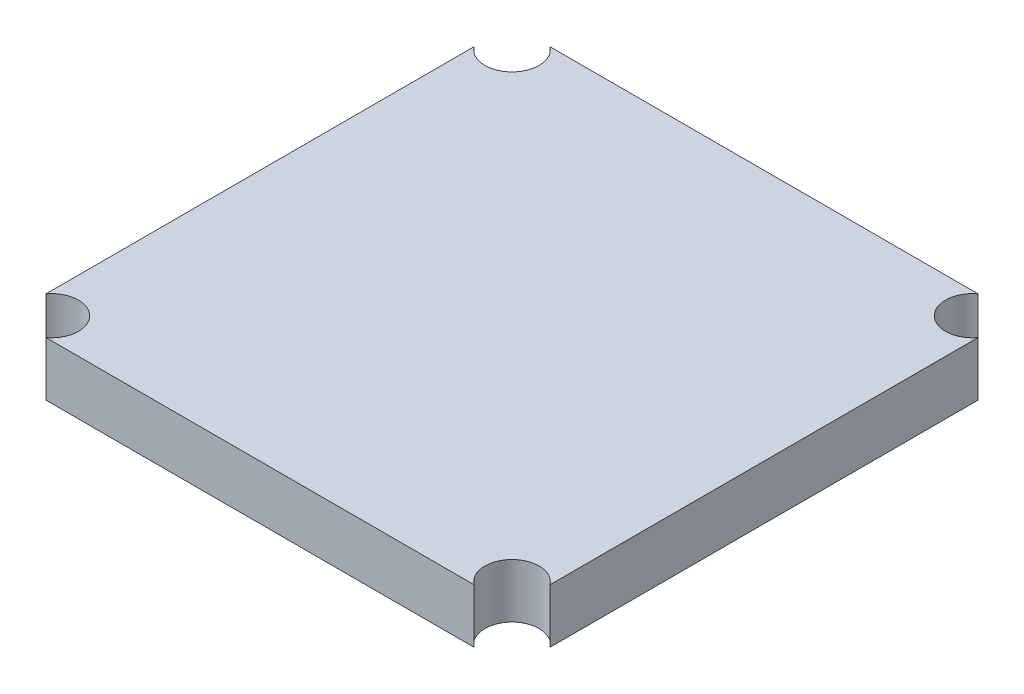
ISO-10303-21;
HEADER;
FILE_DESCRIPTION(('STEP AP214'),'2;1');
FILE_NAME('part.step','',(''),(''),'','','');
FILE_SCHEMA(('AUTOMOTIVE_DESIGN { 1 0 10303 214 1 1 1 1 }'));
ENDSEC;
DATA;
#1=APPLICATION_CONTEXT('core data for automotive mechanical design processes');
#2=APPLICATION_PROTOCOL_DEFINITION('international standard','automotive_design',2000,#1);
#3=PRODUCT_CONTEXT('',#1,'mechanical');
#4=PRODUCT('Part','Part','',(#3));
#5=PRODUCT_RELATED_PRODUCT_CATEGORY('part','',(#4));
#6=PRODUCT_DEFINITION_FORMATION('','',#4);
#7=PRODUCT_DEFINITION_CONTEXT('part definition',#1,'design');
#8=PRODUCT_DEFINITION('design','',#6,#7);
#9=PRODUCT_DEFINITION_SHAPE('','',#8);
#10=(LENGTH_UNIT() NAMED_UNIT(*) SI_UNIT(.MILLI.,.METRE.));
#11=(NAMED_UNIT(*) PLANE_ANGLE_UNIT() SI_UNIT($,.RADIAN.));
#12=(NAMED_UNIT(*) SI_UNIT($,.STERADIAN.) SOLID_ANGLE_UNIT());
#13=UNCERTAINTY_MEASURE_WITH_UNIT(LENGTH_MEASURE(1.E-05),#10,'distance_accuracy_value','');
#14=(GEOMETRIC_REPRESENTATION_CONTEXT(3) GLOBAL_UNCERTAINTY_ASSIGNED_CONTEXT((#13)) GLOBAL_UNIT_ASSIGNED_CONTEXT((#10,
#11,#12)) REPRESENTATION_CONTEXT('',''));
#15=CARTESIAN_POINT('',(0.,0.,0.));
#16=DIRECTION('',(0.,0.,1.));
#17=DIRECTION('',(1.,0.,0.));
#18=AXIS2_PLACEMENT_3D('',#15,#16,#17);
#19=CARTESIAN_POINT('',(-12.75,3.,12.75));
#20=DIRECTION('',(0.,-1.,0.));
#21=DIRECTION('',(0.,0.,-1.));
#22=AXIS2_PLACEMENT_3D('',#19,#20,#21);
#23=CYLINDRICAL_SURFACE('',#22,1.50000000000017);
#24=CARTESIAN_POINT('',(-12.75,0.,12.75));
#25=DIRECTION('',(0.,1.,0.));
#26=DIRECTION('',(0.,0.,1.));
#27=AXIS2_PLACEMENT_3D('',#24,#25,#26);
#28=CIRCLE('',#27,1.50000000000017);
#29=CARTESIAN_POINT('',(-11.85,0.,13.95));
#30=VERTEX_POINT('',#29);
#31=CARTESIAN_POINT('',(-13.95,0.,11.8499999999997));
#32=VERTEX_POINT('',#31);
#33=EDGE_CURVE('E129',#30,#32,#28,.T.);
#34=ORIENTED_EDGE('',*,*,#33,.F.);
#35=DIRECTION('',(0.,-1.,0.));
#36=VECTOR('',#35,1.);
#37=CARTESIAN_POINT('',(-11.85,3.,13.95));
#38=LINE('',#37,#36);
#39=CARTESIAN_POINT('',(-11.85,3.,13.95));
#40=VERTEX_POINT('',#39);
#41=EDGE_CURVE('E11',#40,#30,#38,.T.);
#42=ORIENTED_EDGE('',*,*,#41,.F.);
#43=CARTESIAN_POINT('',(-12.75,3.,12.75));
#44=DIRECTION('',(0.,1.,0.));
#45=DIRECTION('',(0.,0.,1.));
#46=AXIS2_PLACEMENT_3D('',#43,#44,#45);
#47=CIRCLE('',#46,1.50000000000017);
#48=CARTESIAN_POINT('',(-13.95,3.,11.8499999999997));
#49=VERTEX_POINT('',#48);
#50=EDGE_CURVE('E149',#40,#49,#47,.T.);
#51=ORIENTED_EDGE('',*,*,#50,.T.);
#52=DIRECTION('',(0.,-1.,0.));
#53=VECTOR('',#52,1.);
#54=CARTESIAN_POINT('',(-13.95,3.,11.8499999999997));
#55=LINE('',#54,#53);
#56=EDGE_CURVE('E86',#49,#32,#55,.T.);
#57=ORIENTED_EDGE('',*,*,#56,.T.);
#58=EDGE_LOOP('',(#34,#42,#51,#57));
#59=FACE_BOUND('',#58,.T.);
#60=ADVANCED_FACE('F36',(#59),#23,.F.);
#61=CARTESIAN_POINT('',(0.,3.,13.95));
#62=DIRECTION('',(0.,0.,-1.));
#63=DIRECTION('',(-1.,0.,0.));
#64=AXIS2_PLACEMENT_3D('',#61,#62,#63);
#65=PLANE('',#64);
#66=DIRECTION('',(1.,0.,0.));
#67=VECTOR('',#66,1.);
#68=CARTESIAN_POINT('',(0.,0.,13.95));
#69=LINE('',#68,#67);
#70=CARTESIAN_POINT('',(11.85,0.,13.95));
#71=VERTEX_POINT('',#70);
#72=EDGE_CURVE('E132',#30,#71,#69,.T.);
#73=ORIENTED_EDGE('',*,*,#72,.T.);
#74=DIRECTION('',(0.,-1.,0.));
#75=VECTOR('',#74,1.);
#76=CARTESIAN_POINT('',(11.85,3.,13.95));
#77=LINE('',#76,#75);
#78=CARTESIAN_POINT('',(11.85,3.,13.95));
#79=VERTEX_POINT('',#78);
#80=EDGE_CURVE('E44',#79,#71,#77,.T.);
#81=ORIENTED_EDGE('',*,*,#80,.F.);
#82=DIRECTION('',(1.,0.,0.));
#83=VECTOR('',#82,1.);
#84=CARTESIAN_POINT('',(0.,3.,13.95));
#85=LINE('',#84,#83);
#86=EDGE_CURVE('E176',#40,#79,#85,.T.);
#87=ORIENTED_EDGE('',*,*,#86,.F.);
#88=ORIENTED_EDGE('',*,*,#41,.T.);
#89=EDGE_LOOP('',(#73,#81,#87,#88));
#90=FACE_BOUND('',#89,.T.);
#91=ADVANCED_FACE('F165',(#90),#65,.F.);
#92=CARTESIAN_POINT('',(12.75,3.,12.75));
#93=DIRECTION('',(0.,-1.,0.));
#94=DIRECTION('',(0.,0.,-1.));
#95=AXIS2_PLACEMENT_3D('',#92,#93,#94);
#96=CYLINDRICAL_SURFACE('',#95,1.50000000000011);
#97=CARTESIAN_POINT('',(12.75,0.,12.75));
#98=DIRECTION('',(0.,1.,0.));
#99=DIRECTION('',(0.,0.,1.));
#100=AXIS2_PLACEMENT_3D('',#97,#98,#99);
#101=CIRCLE('',#100,1.50000000000011);
#102=CARTESIAN_POINT('',(13.95,0.,11.85));
#103=VERTEX_POINT('',#102);
#104=EDGE_CURVE('E135',#103,#71,#101,.T.);
#105=ORIENTED_EDGE('',*,*,#104,.F.);
#106=DIRECTION('',(0.,-1.,0.));
#107=VECTOR('',#106,1.);
#108=CARTESIAN_POINT('',(13.95,3.,11.85));
#109=LINE('',#108,#107);
#110=CARTESIAN_POINT('',(13.95,3.,11.85));
#111=VERTEX_POINT('',#110);
#112=EDGE_CURVE('E155',#111,#103,#109,.T.);
#113=ORIENTED_EDGE('',*,*,#112,.F.);
#114=CARTESIAN_POINT('',(12.75,3.,12.75));
#115=DIRECTION('',(0.,1.,0.));
#116=DIRECTION('',(0.,0.,1.));
#117=AXIS2_PLACEMENT_3D('',#114,#115,#116);
#118=CIRCLE('',#117,1.50000000000011);
#119=EDGE_CURVE('E162',#111,#79,#118,.T.);
#120=ORIENTED_EDGE('',*,*,#119,.T.);
#121=ORIENTED_EDGE('',*,*,#80,.T.);
#122=EDGE_LOOP('',(#105,#113,#120,#121));
#123=FACE_BOUND('',#122,.T.);
#124=ADVANCED_FACE('F160',(#123),#96,.F.);
#125=CARTESIAN_POINT('',(13.95,3.,0.));
#126=DIRECTION('',(-1.,0.,0.));
#127=DIRECTION('',(0.,0.,1.));
#128=AXIS2_PLACEMENT_3D('',#125,#126,#127);
#129=PLANE('',#128);
#130=DIRECTION('',(0.,0.,-1.));
#131=VECTOR('',#130,1.);
#132=CARTESIAN_POINT('',(13.95,0.,0.));
#133=LINE('',#132,#131);
#134=CARTESIAN_POINT('',(13.95,0.,-11.85));
#135=VERTEX_POINT('',#134);
#136=EDGE_CURVE('E138',#103,#135,#133,.T.);
#137=ORIENTED_EDGE('',*,*,#136,.T.);
#138=DIRECTION('',(0.,-1.,0.));
#139=VECTOR('',#138,1.);
#140=CARTESIAN_POINT('',(13.95,3.,-11.85));
#141=LINE('',#140,#139);
#142=CARTESIAN_POINT('',(13.95,3.,-11.85));
#143=VERTEX_POINT('',#142);
#144=EDGE_CURVE('E153',#143,#135,#141,.T.);
#145=ORIENTED_EDGE('',*,*,#144,.F.);
#146=DIRECTION('',(0.,0.,-1.));
#147=VECTOR('',#146,1.);
#148=CARTESIAN_POINT('',(13.95,3.,0.));
#149=LINE('',#148,#147);
#150=EDGE_CURVE('E174',#111,#143,#149,.T.);
#151=ORIENTED_EDGE('',*,*,#150,.F.);
#152=ORIENTED_EDGE('',*,*,#112,.T.);
#153=EDGE_LOOP('',(#137,#145,#151,#152));
#154=FACE_BOUND('',#153,.T.);
#155=ADVANCED_FACE('F172',(#154),#129,.F.);
#156=CARTESIAN_POINT('',(12.75,3.,-12.75));
#157=DIRECTION('',(0.,-1.,0.));
#158=DIRECTION('',(0.,0.,-1.));
#159=AXIS2_PLACEMENT_3D('',#156,#157,#158);
#160=CYLINDRICAL_SURFACE('',#159,1.50000000000006);
#161=CARTESIAN_POINT('',(12.75,0.,-12.75));
#162=DIRECTION('',(0.,1.,0.));
#163=DIRECTION('',(0.,0.,1.));
#164=AXIS2_PLACEMENT_3D('',#161,#162,#163);
#165=CIRCLE('',#164,1.50000000000006);
#166=CARTESIAN_POINT('',(11.85,0.,-13.95));
#167=VERTEX_POINT('',#166);
#168=EDGE_CURVE('E141',#167,#135,#165,.T.);
#169=ORIENTED_EDGE('',*,*,#168,.F.);
#170=DIRECTION('',(0.,-1.,0.));
#171=VECTOR('',#170,1.);
#172=CARTESIAN_POINT('',(11.85,3.,-13.95));
#173=LINE('',#172,#171);
#174=CARTESIAN_POINT('',(11.85,3.,-13.95));
#175=VERTEX_POINT('',#174);
#176=EDGE_CURVE('E122',#175,#167,#173,.T.);
#177=ORIENTED_EDGE('',*,*,#176,.F.);
#178=CARTESIAN_POINT('',(12.75,3.,-12.75));
#179=DIRECTION('',(0.,1.,0.));
#180=DIRECTION('',(0.,0.,1.));
#181=AXIS2_PLACEMENT_3D('',#178,#179,#180);
#182=CIRCLE('',#181,1.50000000000006);
#183=EDGE_CURVE('E111',#175,#143,#182,.T.);
#184=ORIENTED_EDGE('',*,*,#183,.T.);
#185=ORIENTED_EDGE('',*,*,#144,.T.);
#186=EDGE_LOOP('',(#169,#177,#184,#185));
#187=FACE_BOUND('',#186,.T.);
#188=ADVANCED_FACE('F181',(#187),#160,.F.);
#189=CARTESIAN_POINT('',(0.,3.,-13.95));
#190=DIRECTION('',(0.,0.,1.));
#191=DIRECTION('',(1.,0.,0.));
#192=AXIS2_PLACEMENT_3D('',#189,#190,#191);
#193=PLANE('',#192);
#194=DIRECTION('',(-1.,0.,0.));
#195=VECTOR('',#194,1.);
#196=CARTESIAN_POINT('',(0.,0.,-13.95));
#197=LINE('',#196,#195);
#198=CARTESIAN_POINT('',(-11.85,0.,-13.95));
#199=VERTEX_POINT('',#198);
#200=EDGE_CURVE('E118',#167,#199,#197,.T.);
#201=ORIENTED_EDGE('',*,*,#200,.T.);
#202=DIRECTION('',(0.,-1.,0.));
#203=VECTOR('',#202,1.);
#204=CARTESIAN_POINT('',(-11.85,3.,-13.95));
#205=LINE('',#204,#203);
#206=CARTESIAN_POINT('',(-11.85,3.,-13.95));
#207=VERTEX_POINT('',#206);
#208=EDGE_CURVE('E115',#207,#199,#205,.T.);
#209=ORIENTED_EDGE('',*,*,#208,.F.);
#210=DIRECTION('',(-1.,0.,0.));
#211=VECTOR('',#210,1.);
#212=CARTESIAN_POINT('',(0.,3.,-13.95));
#213=LINE('',#212,#211);
#214=EDGE_CURVE('E105',#175,#207,#213,.T.);
#215=ORIENTED_EDGE('',*,*,#214,.F.);
#216=ORIENTED_EDGE('',*,*,#176,.T.);
#217=EDGE_LOOP('',(#201,#209,#215,#216));
#218=FACE_BOUND('',#217,.T.);
#219=ADVANCED_FACE('F116',(#218),#193,.F.);
#220=CARTESIAN_POINT('',(-12.75,3.,-12.75));
#221=DIRECTION('',(0.,-1.,0.));
#222=DIRECTION('',(0.,0.,-1.));
#223=AXIS2_PLACEMENT_3D('',#220,#221,#222);
#224=CYLINDRICAL_SURFACE('',#223,1.5);
#225=CARTESIAN_POINT('',(-12.75,0.,-12.75));
#226=DIRECTION('',(0.,1.,0.));
#227=DIRECTION('',(0.,0.,1.));
#228=AXIS2_PLACEMENT_3D('',#225,#226,#227);
#229=CIRCLE('',#228,1.5);
#230=CARTESIAN_POINT('',(-13.95,0.,-11.85));
#231=VERTEX_POINT('',#230);
#232=EDGE_CURVE('E145',#231,#199,#229,.T.);
#233=ORIENTED_EDGE('',*,*,#232,.F.);
#234=DIRECTION('',(0.,-1.,0.));
#235=VECTOR('',#234,1.);
#236=CARTESIAN_POINT('',(-13.95,3.,-11.85));
#237=LINE('',#236,#235);
#238=CARTESIAN_POINT('',(-13.95,3.,-11.85));
#239=VERTEX_POINT('',#238);
#240=EDGE_CURVE('E79',#239,#231,#237,.T.);
#241=ORIENTED_EDGE('',*,*,#240,.F.);
#242=CARTESIAN_POINT('',(-12.75,3.,-12.75));
#243=DIRECTION('',(0.,1.,0.));
#244=DIRECTION('',(0.,0.,1.));
#245=AXIS2_PLACEMENT_3D('',#242,#243,#244);
#246=CIRCLE('',#245,1.5);
#247=EDGE_CURVE('E109',#239,#207,#246,.T.);
#248=ORIENTED_EDGE('',*,*,#247,.T.);
#249=ORIENTED_EDGE('',*,*,#208,.T.);
#250=EDGE_LOOP('',(#233,#241,#248,#249));
#251=FACE_BOUND('',#250,.T.);
#252=ADVANCED_FACE('F124',(#251),#224,.F.);
#253=CARTESIAN_POINT('',(-13.95,3.,0.));
#254=DIRECTION('',(1.,0.,0.));
#255=DIRECTION('',(0.,0.,-1.));
#256=AXIS2_PLACEMENT_3D('',#253,#254,#255);
#257=PLANE('',#256);
#258=DIRECTION('',(0.,0.,1.));
#259=VECTOR('',#258,1.);
#260=CARTESIAN_POINT('',(-13.95,0.,0.));
#261=LINE('',#260,#259);
#262=EDGE_CURVE('E147',#231,#32,#261,.T.);
#263=ORIENTED_EDGE('',*,*,#262,.T.);
#264=ORIENTED_EDGE('',*,*,#56,.F.);
#265=DIRECTION('',(0.,0.,1.));
#266=VECTOR('',#265,1.);
#267=CARTESIAN_POINT('',(-13.95,3.,0.));
#268=LINE('',#267,#266);
#269=EDGE_CURVE('E52',#239,#49,#268,.T.);
#270=ORIENTED_EDGE('',*,*,#269,.F.);
#271=ORIENTED_EDGE('',*,*,#240,.T.);
#272=EDGE_LOOP('',(#263,#264,#270,#271));
#273=FACE_BOUND('',#272,.T.);
#274=ADVANCED_FACE('F182',(#273),#257,.F.);
#275=CARTESIAN_POINT('',(0.,3.,0.));
#276=DIRECTION('',(0.,1.,0.));
#277=DIRECTION('',(0.,0.,1.));
#278=AXIS2_PLACEMENT_3D('',#275,#276,#277);
#279=PLANE('',#278);
#280=ORIENTED_EDGE('',*,*,#50,.F.);
#281=ORIENTED_EDGE('',*,*,#86,.T.);
#282=ORIENTED_EDGE('',*,*,#119,.F.);
#283=ORIENTED_EDGE('',*,*,#150,.T.);
#284=ORIENTED_EDGE('',*,*,#183,.F.);
#285=ORIENTED_EDGE('',*,*,#214,.T.);
#286=ORIENTED_EDGE('',*,*,#247,.F.);
#287=ORIENTED_EDGE('',*,*,#269,.T.);
#288=EDGE_LOOP('',(#280,#281,#282,#283,#284,#285,#286,#287));
#289=FACE_BOUND('',#288,.T.);
#290=ADVANCED_FACE('F107',(#289),#279,.T.);
#291=CARTESIAN_POINT('',(0.,0.,0.));
#292=DIRECTION('',(0.,1.,0.));
#293=DIRECTION('',(0.,0.,1.));
#294=AXIS2_PLACEMENT_3D('',#291,#292,#293);
#295=PLANE('',#294);
#296=ORIENTED_EDGE('',*,*,#33,.T.);
#297=ORIENTED_EDGE('',*,*,#262,.F.);
#298=ORIENTED_EDGE('',*,*,#232,.T.);
#299=ORIENTED_EDGE('',*,*,#200,.F.);
#300=ORIENTED_EDGE('',*,*,#168,.T.);
#301=ORIENTED_EDGE('',*,*,#136,.F.);
#302=ORIENTED_EDGE('',*,*,#104,.T.);
#303=ORIENTED_EDGE('',*,*,#72,.F.);
#304=EDGE_LOOP('',(#296,#297,#298,#299,#300,#301,#302,#303));
#305=FACE_BOUND('',#304,.T.);
#306=ADVANCED_FACE('F168',(#305),#295,.F.);
#307=CLOSED_SHELL('',(#60,#91,#124,#155,#188,#219,#252,#274,#290,#306));
#308=MANIFOLD_SOLID_BREP('B2',#307);
#309=ADVANCED_BREP_SHAPE_REPRESENTATION('',(#18,#308),#14);
#310=SHAPE_DEFINITION_REPRESENTATION(#9,#309);
ENDSEC;
END-ISO-10303-21;
